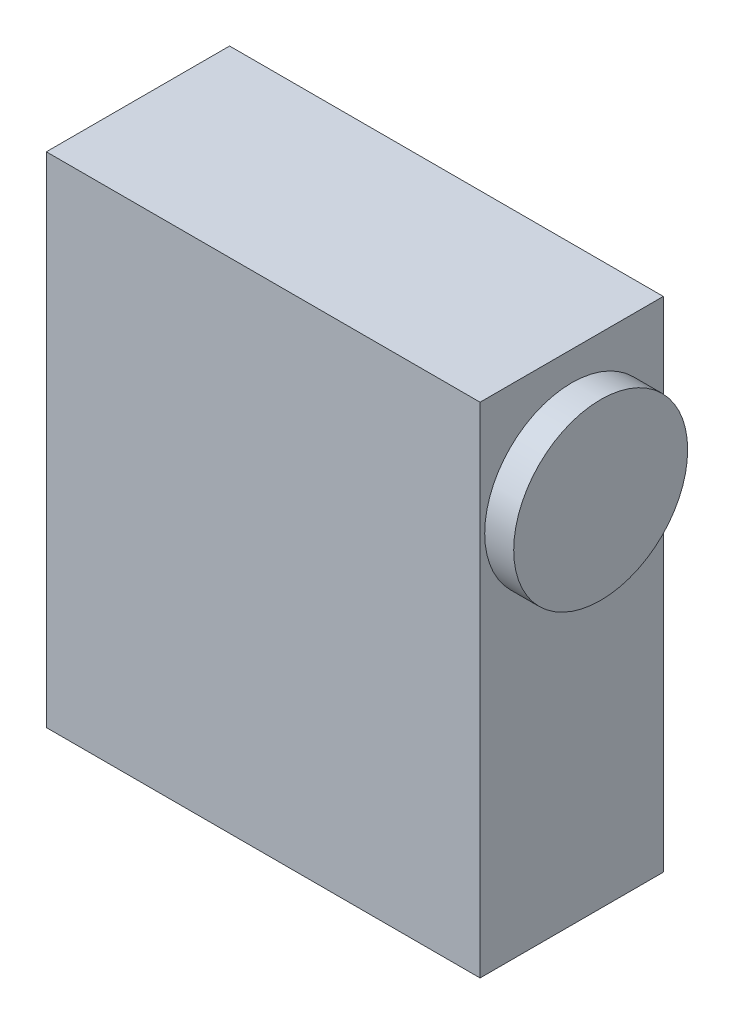
ISO-10303-21;
HEADER;
FILE_DESCRIPTION(('STEP AP214'),'2;1');
FILE_NAME('part.step','',(''),(''),'','','');
FILE_SCHEMA(('AUTOMOTIVE_DESIGN { 1 0 10303 214 1 1 1 1 }'));
ENDSEC;
DATA;
#1=APPLICATION_CONTEXT('core data for automotive mechanical design processes');
#2=APPLICATION_PROTOCOL_DEFINITION('international standard','automotive_design',2000,#1);
#3=PRODUCT_CONTEXT('',#1,'mechanical');
#4=PRODUCT('Part','Part','',(#3));
#5=PRODUCT_RELATED_PRODUCT_CATEGORY('part','',(#4));
#6=PRODUCT_DEFINITION_FORMATION('','',#4);
#7=PRODUCT_DEFINITION_CONTEXT('part definition',#1,'design');
#8=PRODUCT_DEFINITION('design','',#6,#7);
#9=PRODUCT_DEFINITION_SHAPE('','',#8);
#10=(LENGTH_UNIT() NAMED_UNIT(*) SI_UNIT(.MILLI.,.METRE.));
#11=(NAMED_UNIT(*) PLANE_ANGLE_UNIT() SI_UNIT($,.RADIAN.));
#12=(NAMED_UNIT(*) SI_UNIT($,.STERADIAN.) SOLID_ANGLE_UNIT());
#13=UNCERTAINTY_MEASURE_WITH_UNIT(LENGTH_MEASURE(1.E-05),#10,'distance_accuracy_value','');
#14=(GEOMETRIC_REPRESENTATION_CONTEXT(3) GLOBAL_UNCERTAINTY_ASSIGNED_CONTEXT((#13)) GLOBAL_UNIT_ASSIGNED_CONTEXT((#10,
#11,#12)) REPRESENTATION_CONTEXT('',''));
#15=CARTESIAN_POINT('',(0.,0.,0.));
#16=DIRECTION('',(0.,0.,1.));
#17=DIRECTION('',(1.,0.,0.));
#18=AXIS2_PLACEMENT_3D('',#15,#16,#17);
#19=CARTESIAN_POINT('',(0.,54.61,0.));
#20=DIRECTION('',(-1.,0.,0.));
#21=DIRECTION('',(0.,0.,1.));
#22=AXIS2_PLACEMENT_3D('',#19,#20,#21);
#23=PLANE('',#22);
#24=DIRECTION('',(0.,0.,-1.));
#25=VECTOR('',#24,1.);
#26=CARTESIAN_POINT('',(0.,0.,0.));
#27=LINE('',#26,#25);
#28=CARTESIAN_POINT('',(0.,0.,0.));
#29=VERTEX_POINT('',#28);
#30=CARTESIAN_POINT('',(0.,0.,-20.066));
#31=VERTEX_POINT('',#30);
#32=EDGE_CURVE('E109',#29,#31,#27,.T.);
#33=ORIENTED_EDGE('',*,*,#32,.F.);
#34=DIRECTION('',(0.,-1.,0.));
#35=VECTOR('',#34,1.);
#36=CARTESIAN_POINT('',(0.,54.61,0.));
#37=LINE('',#36,#35);
#38=CARTESIAN_POINT('',(0.,54.61,0.));
#39=VERTEX_POINT('',#38);
#40=EDGE_CURVE('E49',#39,#29,#37,.T.);
#41=ORIENTED_EDGE('',*,*,#40,.F.);
#42=DIRECTION('',(0.,0.,-1.));
#43=VECTOR('',#42,1.);
#44=CARTESIAN_POINT('',(0.,54.61,0.));
#45=LINE('',#44,#43);
#46=CARTESIAN_POINT('',(0.,54.61,-20.066));
#47=VERTEX_POINT('',#46);
#48=EDGE_CURVE('E103',#39,#47,#45,.T.);
#49=ORIENTED_EDGE('',*,*,#48,.T.);
#50=DIRECTION('',(0.,-1.,0.));
#51=VECTOR('',#50,1.);
#52=CARTESIAN_POINT('',(0.,54.61,-20.066));
#53=LINE('',#52,#51);
#54=EDGE_CURVE('E81',#47,#31,#53,.T.);
#55=ORIENTED_EDGE('',*,*,#54,.T.);
#56=EDGE_LOOP('',(#33,#41,#49,#55));
#57=FACE_BOUND('',#56,.T.);
#58=ADVANCED_FACE('F41',(#57),#23,.T.);
#59=CARTESIAN_POINT('',(0.,54.61,0.));
#60=DIRECTION('',(0.,0.,-1.));
#61=DIRECTION('',(-1.,0.,0.));
#62=AXIS2_PLACEMENT_3D('',#59,#60,#61);
#63=PLANE('',#62);
#64=DIRECTION('',(1.,0.,0.));
#65=VECTOR('',#64,1.);
#66=CARTESIAN_POINT('',(0.,0.,0.));
#67=LINE('',#66,#65);
#68=CARTESIAN_POINT('',(47.498,0.,0.));
#69=VERTEX_POINT('',#68);
#70=EDGE_CURVE('E73',#29,#69,#67,.T.);
#71=ORIENTED_EDGE('',*,*,#70,.T.);
#72=DIRECTION('',(0.,-1.,0.));
#73=VECTOR('',#72,1.);
#74=CARTESIAN_POINT('',(47.498,54.61,0.));
#75=LINE('',#74,#73);
#76=CARTESIAN_POINT('',(47.498,54.61,0.));
#77=VERTEX_POINT('',#76);
#78=EDGE_CURVE('E100',#77,#69,#75,.T.);
#79=ORIENTED_EDGE('',*,*,#78,.F.);
#80=DIRECTION('',(1.,0.,0.));
#81=VECTOR('',#80,1.);
#82=CARTESIAN_POINT('',(0.,54.61,0.));
#83=LINE('',#82,#81);
#84=EDGE_CURVE('E91',#39,#77,#83,.T.);
#85=ORIENTED_EDGE('',*,*,#84,.F.);
#86=ORIENTED_EDGE('',*,*,#40,.T.);
#87=EDGE_LOOP('',(#71,#79,#85,#86));
#88=FACE_BOUND('',#87,.T.);
#89=ADVANCED_FACE('F134',(#88),#63,.F.);
#90=CARTESIAN_POINT('',(47.498,54.61,0.));
#91=DIRECTION('',(-1.,0.,0.));
#92=DIRECTION('',(0.,0.,1.));
#93=AXIS2_PLACEMENT_3D('',#90,#91,#92);
#94=PLANE('',#93);
#95=CARTESIAN_POINT('',(47.498,41.91,-10.033));
#96=DIRECTION('',(-1.,0.,0.));
#97=DIRECTION('',(0.,0.,1.));
#98=AXIS2_PLACEMENT_3D('',#95,#96,#97);
#99=CIRCLE('',#98,9.525);
#100=CARTESIAN_POINT('',(47.498,41.91,-0.508000000000002));
#101=VERTEX_POINT('',#100);
#102=EDGE_CURVE('E11',#101,#101,#99,.F.);
#103=ORIENTED_EDGE('',*,*,#102,.F.);
#104=EDGE_LOOP('',(#103));
#105=FACE_BOUND('',#104,.T.);
#106=DIRECTION('',(0.,0.,-1.));
#107=VECTOR('',#106,1.);
#108=CARTESIAN_POINT('',(47.498,0.,0.));
#109=LINE('',#108,#107);
#110=CARTESIAN_POINT('',(47.498,0.,-20.066));
#111=VERTEX_POINT('',#110);
#112=EDGE_CURVE('E98',#69,#111,#109,.T.);
#113=ORIENTED_EDGE('',*,*,#112,.T.);
#114=DIRECTION('',(0.,-1.,0.));
#115=VECTOR('',#114,1.);
#116=CARTESIAN_POINT('',(47.498,54.61,-20.066));
#117=LINE('',#116,#115);
#118=CARTESIAN_POINT('',(47.498,54.61,-20.066));
#119=VERTEX_POINT('',#118);
#120=EDGE_CURVE('E95',#119,#111,#117,.T.);
#121=ORIENTED_EDGE('',*,*,#120,.F.);
#122=DIRECTION('',(0.,0.,-1.));
#123=VECTOR('',#122,1.);
#124=CARTESIAN_POINT('',(47.498,54.61,0.));
#125=LINE('',#124,#123);
#126=EDGE_CURVE('E86',#77,#119,#125,.T.);
#127=ORIENTED_EDGE('',*,*,#126,.F.);
#128=ORIENTED_EDGE('',*,*,#78,.T.);
#129=EDGE_LOOP('',(#113,#121,#127,#128));
#130=FACE_BOUND('',#129,.T.);
#131=ADVANCED_FACE('F96',(#105,#130),#94,.F.);
#132=CARTESIAN_POINT('',(0.,54.61,-20.066));
#133=DIRECTION('',(0.,0.,-1.));
#134=DIRECTION('',(-1.,0.,0.));
#135=AXIS2_PLACEMENT_3D('',#132,#133,#134);
#136=PLANE('',#135);
#137=DIRECTION('',(1.,0.,0.));
#138=VECTOR('',#137,1.);
#139=CARTESIAN_POINT('',(0.,0.,-20.066));
#140=LINE('',#139,#138);
#141=EDGE_CURVE('E112',#31,#111,#140,.T.);
#142=ORIENTED_EDGE('',*,*,#141,.F.);
#143=ORIENTED_EDGE('',*,*,#54,.F.);
#144=DIRECTION('',(1.,0.,0.));
#145=VECTOR('',#144,1.);
#146=CARTESIAN_POINT('',(0.,54.61,-20.066));
#147=LINE('',#146,#145);
#148=EDGE_CURVE('E90',#47,#119,#147,.T.);
#149=ORIENTED_EDGE('',*,*,#148,.T.);
#150=ORIENTED_EDGE('',*,*,#120,.T.);
#151=EDGE_LOOP('',(#142,#143,#149,#150));
#152=FACE_BOUND('',#151,.T.);
#153=ADVANCED_FACE('F102',(#152),#136,.T.);
#154=CARTESIAN_POINT('',(0.,54.61,0.));
#155=DIRECTION('',(0.,-1.,0.));
#156=DIRECTION('',(0.,0.,-1.));
#157=AXIS2_PLACEMENT_3D('',#154,#155,#156);
#158=PLANE('',#157);
#159=ORIENTED_EDGE('',*,*,#48,.F.);
#160=ORIENTED_EDGE('',*,*,#84,.T.);
#161=ORIENTED_EDGE('',*,*,#126,.T.);
#162=ORIENTED_EDGE('',*,*,#148,.F.);
#163=EDGE_LOOP('',(#159,#160,#161,#162));
#164=FACE_BOUND('',#163,.T.);
#165=ADVANCED_FACE('F89',(#164),#158,.F.);
#166=CARTESIAN_POINT('',(0.,0.,0.));
#167=DIRECTION('',(0.,-1.,0.));
#168=DIRECTION('',(0.,0.,-1.));
#169=AXIS2_PLACEMENT_3D('',#166,#167,#168);
#170=PLANE('',#169);
#171=ORIENTED_EDGE('',*,*,#32,.T.);
#172=ORIENTED_EDGE('',*,*,#141,.T.);
#173=ORIENTED_EDGE('',*,*,#112,.F.);
#174=ORIENTED_EDGE('',*,*,#70,.F.);
#175=EDGE_LOOP('',(#171,#172,#173,#174));
#176=FACE_BOUND('',#175,.T.);
#177=ADVANCED_FACE('F119',(#176),#170,.T.);
#178=CARTESIAN_POINT('',(50.673,41.91,-10.033));
#179=DIRECTION('',(-1.,0.,0.));
#180=DIRECTION('',(0.,0.,1.));
#181=AXIS2_PLACEMENT_3D('',#178,#179,#180);
#182=CYLINDRICAL_SURFACE('',#181,9.525);
#183=CARTESIAN_POINT('',(50.673,41.91,-10.033));
#184=DIRECTION('',(1.,0.,0.));
#185=DIRECTION('',(0.,0.,-1.));
#186=AXIS2_PLACEMENT_3D('',#183,#184,#185);
#187=CIRCLE('',#186,9.525);
#188=CARTESIAN_POINT('',(50.673,41.91,-19.558));
#189=VERTEX_POINT('',#188);
#190=EDGE_CURVE('E113',#189,#189,#187,.T.);
#191=ORIENTED_EDGE('',*,*,#190,.F.);
#192=EDGE_LOOP('',(#191));
#193=FACE_BOUND('',#192,.T.);
#194=ORIENTED_EDGE('',*,*,#102,.T.);
#195=EDGE_LOOP('',(#194));
#196=FACE_BOUND('',#195,.T.);
#197=ADVANCED_FACE('F121',(#193,#196),#182,.T.);
#198=CARTESIAN_POINT('',(50.673,41.91,-10.033));
#199=DIRECTION('',(1.,0.,0.));
#200=DIRECTION('',(0.,0.,-1.));
#201=AXIS2_PLACEMENT_3D('',#198,#199,#200);
#202=PLANE('',#201);
#203=ORIENTED_EDGE('',*,*,#190,.T.);
#204=EDGE_LOOP('',(#203));
#205=FACE_BOUND('',#204,.T.);
#206=ADVANCED_FACE('F128',(#205),#202,.T.);
#207=CLOSED_SHELL('',(#58,#89,#131,#153,#165,#177,#197,#206));
#208=MANIFOLD_SOLID_BREP('B2',#207);
#209=ADVANCED_BREP_SHAPE_REPRESENTATION('',(#18,#208),#14);
#210=SHAPE_DEFINITION_REPRESENTATION(#9,#209);
ENDSEC;
END-ISO-10303-21;
